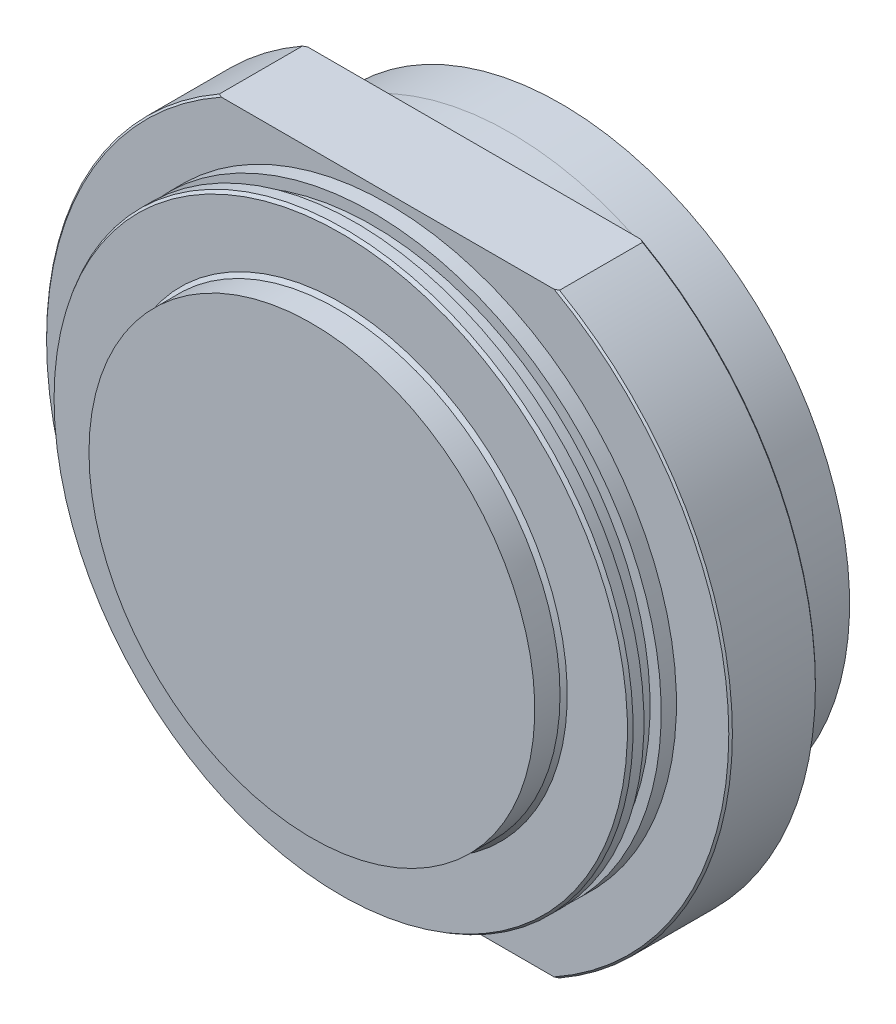
ISO-10303-21;
HEADER;
FILE_DESCRIPTION(('STEP AP214'),'2;1');
FILE_NAME('part.step','',(''),(''),'','','');
FILE_SCHEMA(('AUTOMOTIVE_DESIGN { 1 0 10303 214 1 1 1 1 }'));
ENDSEC;
DATA;
#1=APPLICATION_CONTEXT('core data for automotive mechanical design processes');
#2=APPLICATION_PROTOCOL_DEFINITION('international standard','automotive_design',2000,#1);
#3=PRODUCT_CONTEXT('',#1,'mechanical');
#4=PRODUCT('Part','Part','',(#3));
#5=PRODUCT_RELATED_PRODUCT_CATEGORY('part','',(#4));
#6=PRODUCT_DEFINITION_FORMATION('','',#4);
#7=PRODUCT_DEFINITION_CONTEXT('part definition',#1,'design');
#8=PRODUCT_DEFINITION('design','',#6,#7);
#9=PRODUCT_DEFINITION_SHAPE('','',#8);
#10=(LENGTH_UNIT() NAMED_UNIT(*) SI_UNIT(.MILLI.,.METRE.));
#11=(NAMED_UNIT(*) PLANE_ANGLE_UNIT() SI_UNIT($,.RADIAN.));
#12=(NAMED_UNIT(*) SI_UNIT($,.STERADIAN.) SOLID_ANGLE_UNIT());
#13=UNCERTAINTY_MEASURE_WITH_UNIT(LENGTH_MEASURE(1.E-05),#10,'distance_accuracy_value','');
#14=(GEOMETRIC_REPRESENTATION_CONTEXT(3) GLOBAL_UNCERTAINTY_ASSIGNED_CONTEXT((#13)) GLOBAL_UNIT_ASSIGNED_CONTEXT((#10,
#11,#12)) REPRESENTATION_CONTEXT('',''));
#15=CARTESIAN_POINT('',(0.,0.,0.));
#16=DIRECTION('',(0.,0.,1.));
#17=DIRECTION('',(1.,0.,0.));
#18=AXIS2_PLACEMENT_3D('',#15,#16,#17);
#19=CARTESIAN_POINT('',(1566.75,7.25022612595191E-12,1546.));
#20=DIRECTION('',(0.,0.,-1.));
#21=DIRECTION('',(-1.,0.,0.));
#22=AXIS2_PLACEMENT_3D('',#19,#20,#21);
#23=PLANE('',#22);
#24=CARTESIAN_POINT('',(1505.,7.24936917255478E-12,1546.));
#25=DIRECTION('',(0.,0.,-1.));
#26=DIRECTION('',(-1.,0.,0.));
#27=AXIS2_PLACEMENT_3D('',#24,#25,#26);
#28=CIRCLE('',#27,61.75);
#29=CARTESIAN_POINT('',(1443.25,7.24936917255478E-12,1546.));
#30=VERTEX_POINT('',#29);
#31=EDGE_CURVE('E473',#30,#30,#28,.T.);
#32=ORIENTED_EDGE('',*,*,#31,.F.);
#33=EDGE_LOOP('',(#32));
#34=FACE_BOUND('',#33,.T.);
#35=ADVANCED_FACE('F18',(#34),#23,.F.);
#36=CARTESIAN_POINT('',(1505.,7.24967405020568E-12,1470.));
#37=DIRECTION('',(0.,0.,-1.));
#38=DIRECTION('',(-1.,0.,0.));
#39=AXIS2_PLACEMENT_3D('',#36,#37,#38);
#40=CYLINDRICAL_SURFACE('',#39,61.75);
#41=CARTESIAN_POINT('',(1505.,7.25114412958305E-12,1539.0000000009));
#42=DIRECTION('',(0.,0.,-1.));
#43=DIRECTION('',(1.,0.,0.));
#44=AXIS2_PLACEMENT_3D('',#41,#42,#43);
#45=CIRCLE('',#44,61.7500000008973);
#46=CARTESIAN_POINT('',(1566.7500000009,7.25114412958305E-12,1539.0000000009));
#47=VERTEX_POINT('',#46);
#48=EDGE_CURVE('E475',#47,#47,#45,.T.);
#49=ORIENTED_EDGE('',*,*,#48,.F.);
#50=EDGE_LOOP('',(#49));
#51=FACE_BOUND('',#50,.T.);
#52=ORIENTED_EDGE('',*,*,#31,.T.);
#53=EDGE_LOOP('',(#52));
#54=FACE_BOUND('',#53,.T.);
#55=ADVANCED_FACE('F448',(#51,#54),#40,.T.);
#56=CARTESIAN_POINT('',(1505.,7.25114412958305E-12,1538.));
#57=DIRECTION('',(0.,0.,-1.));
#58=DIRECTION('',(-1.,0.,0.));
#59=AXIS2_PLACEMENT_3D('',#56,#57,#58);
#60=CONICAL_SURFACE('',#59,62.7499999999999,0.785398162500055);
#61=CARTESIAN_POINT('',(1505.,7.25114412958305E-12,1538.));
#62=DIRECTION('',(0.,0.,-1.));
#63=DIRECTION('',(-1.,0.,0.));
#64=AXIS2_PLACEMENT_3D('',#61,#62,#63);
#65=CIRCLE('',#64,62.7499999999999);
#66=CARTESIAN_POINT('',(1442.25,7.25114412958305E-12,1538.));
#67=VERTEX_POINT('',#66);
#68=EDGE_CURVE('E479',#67,#67,#65,.F.);
#69=ORIENTED_EDGE('',*,*,#68,.T.);
#70=EDGE_LOOP('',(#69));
#71=FACE_BOUND('',#70,.T.);
#72=ORIENTED_EDGE('',*,*,#48,.T.);
#73=EDGE_LOOP('',(#72));
#74=FACE_BOUND('',#73,.T.);
#75=ADVANCED_FACE('F438',(#71,#74),#60,.T.);
#76=CARTESIAN_POINT('',(1585.,7.25051148796371E-12,1538.));
#77=DIRECTION('',(0.,0.,-1.));
#78=DIRECTION('',(-1.,0.,0.));
#79=AXIS2_PLACEMENT_3D('',#76,#77,#78);
#80=PLANE('',#79);
#81=ORIENTED_EDGE('',*,*,#68,.F.);
#82=EDGE_LOOP('',(#81));
#83=FACE_BOUND('',#82,.T.);
#84=CARTESIAN_POINT('',(1505.,7.24975635080179E-12,1538.00000000035));
#85=DIRECTION('',(0.,0.,-1.));
#86=DIRECTION('',(-1.,0.,0.));
#87=AXIS2_PLACEMENT_3D('',#84,#85,#86);
#88=CIRCLE('',#87,79.4226497314088);
#89=CARTESIAN_POINT('',(1425.57735026859,7.24975635080179E-12,1538.00000000035));
#90=VERTEX_POINT('',#89);
#91=EDGE_CURVE('E597',#90,#90,#88,.T.);
#92=ORIENTED_EDGE('',*,*,#91,.F.);
#93=EDGE_LOOP('',(#92));
#94=FACE_BOUND('',#93,.T.);
#95=ADVANCED_FACE('F428',(#83,#94),#80,.F.);
#96=CARTESIAN_POINT('',(1505.,7.25114412958305E-12,1537.));
#97=DIRECTION('',(0.,0.,-1.));
#98=DIRECTION('',(-1.,0.,0.));
#99=AXIS2_PLACEMENT_3D('',#96,#97,#98);
#100=CONICAL_SURFACE('',#99,80.0000000000001,0.52359877499999);
#101=CARTESIAN_POINT('',(1505.,7.24940527648712E-12,1537.));
#102=DIRECTION('',(0.,0.,-1.));
#103=DIRECTION('',(-1.,0.,0.));
#104=AXIS2_PLACEMENT_3D('',#101,#102,#103);
#105=CIRCLE('',#104,80.);
#106=CARTESIAN_POINT('',(1425.,7.24940527648712E-12,1537.));
#107=VERTEX_POINT('',#106);
#108=EDGE_CURVE('E596',#107,#107,#105,.T.);
#109=ORIENTED_EDGE('',*,*,#108,.F.);
#110=EDGE_LOOP('',(#109));
#111=FACE_BOUND('',#110,.T.);
#112=ORIENTED_EDGE('',*,*,#91,.T.);
#113=EDGE_LOOP('',(#112));
#114=FACE_BOUND('',#113,.T.);
#115=ADVANCED_FACE('F418',(#111,#114),#100,.T.);
#116=CARTESIAN_POINT('',(1505.,7.24967405020568E-12,1470.));
#117=DIRECTION('',(0.,0.,-1.));
#118=DIRECTION('',(-1.,0.,0.));
#119=AXIS2_PLACEMENT_3D('',#116,#117,#118);
#120=CYLINDRICAL_SURFACE('',#119,80.);
#121=CARTESIAN_POINT('',(1505.,7.24941731113123E-12,1534.));
#122=DIRECTION('',(0.,0.,-1.));
#123=DIRECTION('',(-1.,0.,0.));
#124=AXIS2_PLACEMENT_3D('',#121,#122,#123);
#125=CIRCLE('',#124,80.);
#126=CARTESIAN_POINT('',(1425.,7.24941731113123E-12,1534.));
#127=VERTEX_POINT('',#126);
#128=EDGE_CURVE('E594',#127,#127,#125,.F.);
#129=ORIENTED_EDGE('',*,*,#128,.T.);
#130=EDGE_LOOP('',(#129));
#131=FACE_BOUND('',#130,.T.);
#132=ORIENTED_EDGE('',*,*,#108,.T.);
#133=EDGE_LOOP('',(#132));
#134=FACE_BOUND('',#133,.T.);
#135=ADVANCED_FACE('F408',(#131,#134),#120,.T.);
#136=CARTESIAN_POINT('',(1581.915,7.25048472118048E-12,1534.));
#137=DIRECTION('',(0.,0.,1.));
#138=DIRECTION('',(0.,-1.,0.));
#139=AXIS2_PLACEMENT_3D('',#136,#137,#138);
#140=PLANE('',#139);
#141=CARTESIAN_POINT('',(1505.,7.24941731113123E-12,1534.));
#142=DIRECTION('',(0.,0.,-1.));
#143=DIRECTION('',(-1.,0.,0.));
#144=AXIS2_PLACEMENT_3D('',#141,#142,#143);
#145=CIRCLE('',#144,76.915);
#146=CARTESIAN_POINT('',(1428.085,7.24941731113123E-12,1534.));
#147=VERTEX_POINT('',#146);
#148=EDGE_CURVE('E591',#147,#147,#145,.T.);
#149=ORIENTED_EDGE('',*,*,#148,.F.);
#150=EDGE_LOOP('',(#149));
#151=FACE_BOUND('',#150,.T.);
#152=ORIENTED_EDGE('',*,*,#128,.F.);
#153=EDGE_LOOP('',(#152));
#154=FACE_BOUND('',#153,.T.);
#155=ADVANCED_FACE('F398',(#151,#154),#140,.F.);
#156=CARTESIAN_POINT('',(1505.,7.24967405020568E-12,1470.));
#157=DIRECTION('',(0.,0.,-1.));
#158=DIRECTION('',(-1.,0.,0.));
#159=AXIS2_PLACEMENT_3D('',#156,#157,#158);
#160=CYLINDRICAL_SURFACE('',#159,76.915);
#161=CARTESIAN_POINT('',(1505.,7.24943648633086E-12,1529.22));
#162=DIRECTION('',(0.,0.,-1.));
#163=DIRECTION('',(-1.,0.,0.));
#164=AXIS2_PLACEMENT_3D('',#161,#162,#163);
#165=CIRCLE('',#164,76.915);
#166=CARTESIAN_POINT('',(1428.085,7.24943648633086E-12,1529.22));
#167=VERTEX_POINT('',#166);
#168=EDGE_CURVE('E588',#167,#167,#165,.F.);
#169=ORIENTED_EDGE('',*,*,#168,.T.);
#170=EDGE_LOOP('',(#169));
#171=FACE_BOUND('',#170,.T.);
#172=ORIENTED_EDGE('',*,*,#148,.T.);
#173=EDGE_LOOP('',(#172));
#174=FACE_BOUND('',#173,.T.);
#175=ADVANCED_FACE('F388',(#171,#174),#160,.T.);
#176=CARTESIAN_POINT('',(1585.,7.25054670935549E-12,1529.22));
#177=DIRECTION('',(0.,0.,-1.));
#178=DIRECTION('',(-1.,0.,0.));
#179=AXIS2_PLACEMENT_3D('',#176,#177,#178);
#180=PLANE('',#179);
#181=CARTESIAN_POINT('',(1505.,7.24943648633086E-12,1529.22));
#182=DIRECTION('',(0.,0.,-1.));
#183=DIRECTION('',(-1.,0.,0.));
#184=AXIS2_PLACEMENT_3D('',#181,#182,#183);
#185=CIRCLE('',#184,80.);
#186=CARTESIAN_POINT('',(1425.,7.24943648633086E-12,1529.22));
#187=VERTEX_POINT('',#186);
#188=EDGE_CURVE('E584',#187,#187,#185,.T.);
#189=ORIENTED_EDGE('',*,*,#188,.F.);
#190=EDGE_LOOP('',(#189));
#191=FACE_BOUND('',#190,.T.);
#192=ORIENTED_EDGE('',*,*,#168,.F.);
#193=EDGE_LOOP('',(#192));
#194=FACE_BOUND('',#193,.T.);
#195=ADVANCED_FACE('F378',(#191,#194),#180,.F.);
#196=CARTESIAN_POINT('',(1505.,7.24967405020568E-12,1470.));
#197=DIRECTION('',(0.,0.,-1.));
#198=DIRECTION('',(-1.,0.,0.));
#199=AXIS2_PLACEMENT_3D('',#196,#197,#198);
#200=CYLINDRICAL_SURFACE('',#199,80.);
#201=CARTESIAN_POINT('',(1505.,7.24945341506358E-12,1525.));
#202=DIRECTION('',(0.,0.,-1.));
#203=DIRECTION('',(-1.,0.,0.));
#204=AXIS2_PLACEMENT_3D('',#201,#202,#203);
#205=CIRCLE('',#204,80.);
#206=CARTESIAN_POINT('',(1425.,7.24945341506358E-12,1525.));
#207=VERTEX_POINT('',#206);
#208=EDGE_CURVE('E567',#207,#207,#205,.F.);
#209=ORIENTED_EDGE('',*,*,#208,.T.);
#210=EDGE_LOOP('',(#209));
#211=FACE_BOUND('',#210,.T.);
#212=ORIENTED_EDGE('',*,*,#188,.T.);
#213=EDGE_LOOP('',(#212));
#214=FACE_BOUND('',#213,.T.);
#215=ADVANCED_FACE('F368',(#211,#214),#200,.T.);
#216=CARTESIAN_POINT('',(1505.,7.25114412958305E-12,1524.5));
#217=DIRECTION('',(0.,0.,-1.));
#218=DIRECTION('',(-1.,0.,0.));
#219=AXIS2_PLACEMENT_3D('',#216,#217,#218);
#220=CONICAL_SURFACE('',#219,94.9999999999993,0.785398162499944);
#221=CARTESIAN_POINT('',(1551.08687448743,82.5000000003991,1525.00000000045));
#222=CARTESIAN_POINT('',(1551.12918921244,82.5000000003743,1524.97936345623));
#223=CARTESIAN_POINT('',(1551.17149540316,82.5000000002466,1524.95870941293));
#224=CARTESIAN_POINT('',(1551.25612415679,82.4999999999069,1524.91735012217));
#225=CARTESIAN_POINT('',(1551.29844670623,82.4999999996949,1524.89664484716));
#226=CARTESIAN_POINT('',(1551.38310824844,82.4999999993086,1524.85518309306));
#227=CARTESIAN_POINT('',(1551.42544722771,82.4999999991342,1524.83442658642));
#228=CARTESIAN_POINT('',(1551.51014170056,82.4999999988857,1524.79286236904));
#229=CARTESIAN_POINT('',(1551.55249718061,82.4999999988116,1524.77205463075));
#230=CARTESIAN_POINT('',(1551.6372247257,82.4999999987843,1524.73038795008));
#231=CARTESIAN_POINT('',(1551.67959677719,82.4999999988312,1524.70952898015));
#232=CARTESIAN_POINT('',(1551.76435753565,82.4999999990214,1524.66775983618));
#233=CARTESIAN_POINT('',(1551.80674622904,82.4999999991647,1524.6468496346));
#234=CARTESIAN_POINT('',(1551.8915403415,82.4999999994834,1524.60497802735));
#235=CARTESIAN_POINT('',(1551.93394574698,82.4999999996587,1524.58401659415));
#236=CARTESIAN_POINT('',(1552.01877335365,82.4999999999254,1524.54204252356));
#237=CARTESIAN_POINT('',(1552.06119554122,82.5000000000167,1524.52102985864));
#238=CARTESIAN_POINT('',(1552.10360920354,82.5000000000076,1524.5));
#239=B_SPLINE_CURVE_WITH_KNOTS('',3,(#221,#222,#223,#224,#225,#226,#227,#228,#229,#230,#231,
#232,#233,#234,#235,#236,#237,#238),.UNSPECIFIED.,.F.,.F.,(4,2,2,2,2,2,2,2,4),(0.,
0.14123606127447,0.2825836997736,0.42404320318382,0.565614858090041,0.707298949978761,
0.849095763238674,0.991005581164971,1.13302868595976),.UNSPECIFIED.);
#240=CARTESIAN_POINT('',(1552.10360920354,82.5000000000074,1524.5));
#241=VERTEX_POINT('',#240);
#242=CARTESIAN_POINT('',(1551.08687448778,82.5000000002032,1525.00000000045));
#243=VERTEX_POINT('',#242);
#244=EDGE_CURVE('E647',#241,#243,#239,.F.);
#245=ORIENTED_EDGE('',*,*,#244,.T.);
#246=CARTESIAN_POINT('',(1505.,7.25055980167483E-12,1525.00000000045));
#247=DIRECTION('',(0.,0.,-1.));
#248=DIRECTION('',(-1.,0.,0.));
#249=AXIS2_PLACEMENT_3D('',#246,#247,#248);
#250=CIRCLE('',#249,94.5000000004481);
#251=CARTESIAN_POINT('',(1551.08687448778,-82.5000000001886,1525.00000000045));
#252=VERTEX_POINT('',#251);
#253=EDGE_CURVE('E574',#243,#252,#250,.T.);
#254=ORIENTED_EDGE('',*,*,#253,.T.);
#255=CARTESIAN_POINT('',(1552.10360920354,-82.4999999999929,1524.5));
#256=CARTESIAN_POINT('',(1552.06119554122,-82.500000000002,1524.52102985864));
#257=CARTESIAN_POINT('',(1552.01877335365,-82.4999999999107,1524.54204252356));
#258=CARTESIAN_POINT('',(1551.93394574698,-82.499999999644,1524.58401659415));
#259=CARTESIAN_POINT('',(1551.8915403415,-82.4999999994686,1524.60497802735));
#260=CARTESIAN_POINT('',(1551.80674622904,-82.49999999915,1524.6468496346));
#261=CARTESIAN_POINT('',(1551.76435753565,-82.4999999990067,1524.66775983618));
#262=CARTESIAN_POINT('',(1551.67959677719,-82.4999999988166,1524.70952898015));
#263=CARTESIAN_POINT('',(1551.6372247257,-82.4999999987696,1524.73038795008));
#264=CARTESIAN_POINT('',(1551.55249718061,-82.4999999987969,1524.77205463075));
#265=CARTESIAN_POINT('',(1551.51014170056,-82.4999999988711,1524.79286236904));
#266=CARTESIAN_POINT('',(1551.42544722771,-82.4999999991196,1524.83442658642));
#267=CARTESIAN_POINT('',(1551.38310824844,-82.4999999992938,1524.85518309306));
#268=CARTESIAN_POINT('',(1551.29844670623,-82.4999999996802,1524.89664484716));
#269=CARTESIAN_POINT('',(1551.25612415679,-82.4999999998922,1524.91735012217));
#270=CARTESIAN_POINT('',(1551.17149540316,-82.5000000002319,1524.95870941293));
#271=CARTESIAN_POINT('',(1551.12918921244,-82.5000000003597,1524.97936345623));
#272=CARTESIAN_POINT('',(1551.08687448743,-82.5000000003844,1525.00000000045));
#273=B_SPLINE_CURVE_WITH_KNOTS('',3,(#255,#256,#257,#258,#259,#260,#261,#262,#263,#264,#265,
#266,#267,#268,#269,#270,#271,#272),.UNSPECIFIED.,.F.,.F.,(4,2,2,2,2,2,2,2,4),(0.,
0.142023104794789,0.283932922720887,0.425729735981199,0.56741382786972,0.70898548277594,
0.85044498618616,0.991792624685291,1.13302868595976),.UNSPECIFIED.);
#274=CARTESIAN_POINT('',(1552.10360920354,-82.4999999999928,1524.5));
#275=VERTEX_POINT('',#274);
#276=EDGE_CURVE('E587',#252,#275,#273,.F.);
#277=ORIENTED_EDGE('',*,*,#276,.T.);
#278=CARTESIAN_POINT('',(1505.,7.2494554208376E-12,1524.5));
#279=DIRECTION('',(0.,0.,-1.));
#280=DIRECTION('',(-1.,0.,0.));
#281=AXIS2_PLACEMENT_3D('',#278,#279,#280);
#282=CIRCLE('',#281,95.);
#283=EDGE_CURVE('E565',#241,#275,#282,.T.);
#284=ORIENTED_EDGE('',*,*,#283,.F.);
#285=EDGE_LOOP('',(#245,#254,#277,#284));
#286=FACE_BOUND('',#285,.T.);
#287=ADVANCED_FACE('F358',(#286),#220,.T.);
#288=CARTESIAN_POINT('',(1505.,7.25114412958305E-12,1524.5));
#289=DIRECTION('',(0.,0.,-1.));
#290=DIRECTION('',(-1.,0.,0.));
#291=AXIS2_PLACEMENT_3D('',#288,#289,#290);
#292=CONICAL_SURFACE('',#291,94.9999999999997,0.78539816250061);
#293=CARTESIAN_POINT('',(1458.91312551257,-82.500000000385,1525.00000000045));
#294=CARTESIAN_POINT('',(1458.87081078756,-82.5000000003604,1524.97936345623));
#295=CARTESIAN_POINT('',(1458.82850459684,-82.5000000002329,1524.95870941293));
#296=CARTESIAN_POINT('',(1458.74387584321,-82.4999999998937,1524.91735012217));
#297=CARTESIAN_POINT('',(1458.70155329377,-82.4999999996818,1524.89664484716));
#298=CARTESIAN_POINT('',(1458.61689175156,-82.4999999992957,1524.85518309306));
#299=CARTESIAN_POINT('',(1458.57455277228,-82.4999999991215,1524.83442658641));
#300=CARTESIAN_POINT('',(1458.48985829943,-82.4999999988731,1524.79286236903));
#301=CARTESIAN_POINT('',(1458.44750281939,-82.4999999987991,1524.77205463075));
#302=CARTESIAN_POINT('',(1458.3627752743,-82.4999999987718,1524.73038795007));
#303=CARTESIAN_POINT('',(1458.3204032228,-82.4999999988187,1524.70952898014));
#304=CARTESIAN_POINT('',(1458.23564246435,-82.4999999990087,1524.66775983617));
#305=CARTESIAN_POINT('',(1458.19325377096,-82.4999999991519,1524.6468496346));
#306=CARTESIAN_POINT('',(1458.1084596585,-82.4999999994702,1524.60497802735));
#307=CARTESIAN_POINT('',(1458.06605425301,-82.4999999996455,1524.58401659415));
#308=CARTESIAN_POINT('',(1457.98122664635,-82.4999999999118,1524.54204252355));
#309=CARTESIAN_POINT('',(1457.93880445878,-82.5000000000028,1524.52102985864));
#310=CARTESIAN_POINT('',(1457.89639079646,-82.4999999999934,1524.5));
#311=B_SPLINE_CURVE_WITH_KNOTS('',3,(#293,#294,#295,#296,#297,#298,#299,#300,#301,#302,#303,
#304,#305,#306,#307,#308,#309,#310),.UNSPECIFIED.,.F.,.F.,(4,2,2,2,2,2,2,2,4),(0.,
0.14123606127794,0.282583699779154,0.424043203190762,0.565614858097679,0.707298949985605,
0.849095763244329,0.991005581168443,1.13302868595996),.UNSPECIFIED.);
#312=CARTESIAN_POINT('',(1457.89639079646,-82.4999999999931,1524.5));
#313=VERTEX_POINT('',#312);
#314=CARTESIAN_POINT('',(1458.91312551222,-82.5000000001889,1525.00000000045));
#315=VERTEX_POINT('',#314);
#316=EDGE_CURVE('E568',#313,#315,#311,.F.);
#317=ORIENTED_EDGE('',*,*,#316,.T.);
#318=CARTESIAN_POINT('',(1505.,7.25055980167483E-12,1525.00000000045));
#319=DIRECTION('',(0.,0.,-1.));
#320=DIRECTION('',(-1.,0.,0.));
#321=AXIS2_PLACEMENT_3D('',#318,#319,#320);
#322=CIRCLE('',#321,94.5000000004484);
#323=CARTESIAN_POINT('',(1458.91312551222,82.5000000002034,1525.00000000045));
#324=VERTEX_POINT('',#323);
#325=EDGE_CURVE('E570',#315,#324,#322,.T.);
#326=ORIENTED_EDGE('',*,*,#325,.T.);
#327=CARTESIAN_POINT('',(1457.89639079646,82.5000000000079,1524.5));
#328=CARTESIAN_POINT('',(1457.93880445878,82.5000000000173,1524.52102985864));
#329=CARTESIAN_POINT('',(1457.98122664635,82.4999999999262,1524.54204252355));
#330=CARTESIAN_POINT('',(1458.06605425301,82.4999999996599,1524.58401659415));
#331=CARTESIAN_POINT('',(1458.1084596585,82.4999999994847,1524.60497802735));
#332=CARTESIAN_POINT('',(1458.19325377096,82.4999999991663,1524.6468496346));
#333=CARTESIAN_POINT('',(1458.23564246435,82.4999999990232,1524.66775983617));
#334=CARTESIAN_POINT('',(1458.3204032228,82.4999999988331,1524.70952898014));
#335=CARTESIAN_POINT('',(1458.3627752743,82.4999999987862,1524.73038795007));
#336=CARTESIAN_POINT('',(1458.44750281939,82.4999999988135,1524.77205463075));
#337=CARTESIAN_POINT('',(1458.48985829944,82.4999999988876,1524.79286236903));
#338=CARTESIAN_POINT('',(1458.57455277228,82.499999999136,1524.83442658642));
#339=CARTESIAN_POINT('',(1458.61689175156,82.4999999993102,1524.85518309306));
#340=CARTESIAN_POINT('',(1458.70155329377,82.4999999996963,1524.89664484716));
#341=CARTESIAN_POINT('',(1458.74387584321,82.4999999999081,1524.91735012217));
#342=CARTESIAN_POINT('',(1458.82850459684,82.5000000002474,1524.95870941293));
#343=CARTESIAN_POINT('',(1458.87081078756,82.5000000003749,1524.97936345623));
#344=CARTESIAN_POINT('',(1458.91312551257,82.5000000003994,1525.00000000045));
#345=B_SPLINE_CURVE_WITH_KNOTS('',3,(#327,#328,#329,#330,#331,#332,#333,#334,#335,#336,#337,
#338,#339,#340,#341,#342,#343,#344),.UNSPECIFIED.,.F.,.F.,(4,2,2,2,2,2,2,2,4),(0.,
0.142023104791812,0.283932922715828,0.425729735974849,0.567413827863073,0.708985482769692,
0.850444986181003,0.991792624682514,1.13302868595996),.UNSPECIFIED.);
#346=CARTESIAN_POINT('',(1457.89639079646,82.5000000000076,1524.5));
#347=VERTEX_POINT('',#346);
#348=EDGE_CURVE('E646',#324,#347,#345,.F.);
#349=ORIENTED_EDGE('',*,*,#348,.T.);
#350=CARTESIAN_POINT('',(1505.,7.2494554208376E-12,1524.5));
#351=DIRECTION('',(0.,0.,-1.));
#352=DIRECTION('',(-1.,0.,0.));
#353=AXIS2_PLACEMENT_3D('',#350,#351,#352);
#354=CIRCLE('',#353,95.);
#355=EDGE_CURVE('E533',#313,#347,#354,.T.);
#356=ORIENTED_EDGE('',*,*,#355,.F.);
#357=EDGE_LOOP('',(#317,#326,#349,#356));
#358=FACE_BOUND('',#357,.T.);
#359=ADVANCED_FACE('F348',(#358),#292,.T.);
#360=CARTESIAN_POINT('',(1505.,7.24967405020568E-12,1470.));
#361=DIRECTION('',(0.,0.,-1.));
#362=DIRECTION('',(-1.,0.,0.));
#363=AXIS2_PLACEMENT_3D('',#360,#361,#362);
#364=CYLINDRICAL_SURFACE('',#363,95.);
#365=DIRECTION('',(0.,0.,1.));
#366=VECTOR('',#365,1.);
#367=CARTESIAN_POINT('',(1552.10360920354,-82.4999999999928,1546.));
#368=LINE('',#367,#366);
#369=CARTESIAN_POINT('',(1552.10360920354,-82.4999999999931,1501.5));
#370=VERTEX_POINT('',#369);
#371=EDGE_CURVE('E524',#275,#370,#368,.F.);
#372=ORIENTED_EDGE('',*,*,#371,.T.);
#373=CARTESIAN_POINT('',(1505.,7.25114412958305E-12,1501.5));
#374=DIRECTION('',(0.,0.,1.));
#375=DIRECTION('',(-1.,0.,0.));
#376=AXIS2_PLACEMENT_3D('',#373,#374,#375);
#377=CIRCLE('',#376,94.9999999999995);
#378=CARTESIAN_POINT('',(1552.10360920354,82.5000000000076,1501.5));
#379=VERTEX_POINT('',#378);
#380=EDGE_CURVE('E557',#379,#370,#377,.F.);
#381=ORIENTED_EDGE('',*,*,#380,.F.);
#382=DIRECTION('',(0.,0.,1.));
#383=VECTOR('',#382,1.);
#384=CARTESIAN_POINT('',(1552.10360920354,82.5000000000073,1546.));
#385=LINE('',#384,#383);
#386=EDGE_CURVE('E520',#379,#241,#385,.T.);
#387=ORIENTED_EDGE('',*,*,#386,.T.);
#388=ORIENTED_EDGE('',*,*,#283,.T.);
#389=EDGE_LOOP('',(#372,#381,#387,#388));
#390=FACE_BOUND('',#389,.T.);
#391=ADVANCED_FACE('F338',(#390),#364,.T.);
#392=CARTESIAN_POINT('',(1600.,7.25077180490532E-12,1525.));
#393=DIRECTION('',(0.,0.,-1.));
#394=DIRECTION('',(-1.,0.,0.));
#395=AXIS2_PLACEMENT_3D('',#392,#393,#394);
#396=PLANE('',#395);
#397=DIRECTION('',(1.,0.,0.));
#398=VECTOR('',#397,1.);
#399=CARTESIAN_POINT('',(1552.10360920354,-82.4999999999928,1525.));
#400=LINE('',#399,#398);
#401=EDGE_CURVE('E527',#315,#252,#400,.T.);
#402=ORIENTED_EDGE('',*,*,#401,.T.);
#403=ORIENTED_EDGE('',*,*,#253,.F.);
#404=DIRECTION('',(1.,0.,0.));
#405=VECTOR('',#404,1.);
#406=CARTESIAN_POINT('',(1552.10360920354,82.5000000000073,1525.));
#407=LINE('',#406,#405);
#408=EDGE_CURVE('E517',#243,#324,#407,.F.);
#409=ORIENTED_EDGE('',*,*,#408,.T.);
#410=ORIENTED_EDGE('',*,*,#325,.F.);
#411=EDGE_LOOP('',(#402,#403,#409,#410));
#412=FACE_BOUND('',#411,.T.);
#413=ORIENTED_EDGE('',*,*,#208,.F.);
#414=EDGE_LOOP('',(#413));
#415=FACE_BOUND('',#414,.T.);
#416=ADVANCED_FACE('F328',(#412,#415),#396,.F.);
#417=CARTESIAN_POINT('',(1505.,7.24967405020568E-12,1470.));
#418=DIRECTION('',(0.,0.,-1.));
#419=DIRECTION('',(-1.,0.,0.));
#420=AXIS2_PLACEMENT_3D('',#417,#418,#419);
#421=CYLINDRICAL_SURFACE('',#420,95.);
#422=DIRECTION('',(0.,0.,1.));
#423=VECTOR('',#422,1.);
#424=CARTESIAN_POINT('',(1457.89639079646,82.5000000000073,1546.));
#425=LINE('',#424,#423);
#426=CARTESIAN_POINT('',(1457.89639079646,82.5000000000075,1501.5));
#427=VERTEX_POINT('',#426);
#428=EDGE_CURVE('E514',#347,#427,#425,.F.);
#429=ORIENTED_EDGE('',*,*,#428,.T.);
#430=CARTESIAN_POINT('',(1505.,7.25114412958305E-12,1501.5));
#431=DIRECTION('',(0.,0.,1.));
#432=DIRECTION('',(-1.,0.,0.));
#433=AXIS2_PLACEMENT_3D('',#430,#431,#432);
#434=CIRCLE('',#433,94.9999999999995);
#435=CARTESIAN_POINT('',(1457.89639079646,-82.4999999999929,1501.5));
#436=VERTEX_POINT('',#435);
#437=EDGE_CURVE('E513',#436,#427,#434,.F.);
#438=ORIENTED_EDGE('',*,*,#437,.F.);
#439=DIRECTION('',(0.,0.,1.));
#440=VECTOR('',#439,1.);
#441=CARTESIAN_POINT('',(1457.89639079646,-82.4999999999928,1546.));
#442=LINE('',#441,#440);
#443=EDGE_CURVE('E530',#436,#313,#442,.T.);
#444=ORIENTED_EDGE('',*,*,#443,.T.);
#445=ORIENTED_EDGE('',*,*,#355,.T.);
#446=EDGE_LOOP('',(#429,#438,#444,#445));
#447=FACE_BOUND('',#446,.T.);
#448=ADVANCED_FACE('F318',(#447),#421,.T.);
#449=CARTESIAN_POINT('',(1552.10360920354,-82.4999999999928,1546.));
#450=DIRECTION('',(0.,1.,0.));
#451=DIRECTION('',(0.,0.,1.));
#452=AXIS2_PLACEMENT_3D('',#449,#450,#451);
#453=PLANE('',#452);
#454=DIRECTION('',(1.,0.,0.));
#455=VECTOR('',#454,1.);
#456=CARTESIAN_POINT('',(1585.,-82.4999999999928,1501.));
#457=LINE('',#456,#455);
#458=CARTESIAN_POINT('',(1458.91312551176,-82.5000000001887,1500.99999999978));
#459=VERTEX_POINT('',#458);
#460=CARTESIAN_POINT('',(1551.08687448778,-82.500000000189,1500.99999999955));
#461=VERTEX_POINT('',#460);
#462=EDGE_CURVE('E510',#459,#461,#457,.T.);
#463=ORIENTED_EDGE('',*,*,#462,.T.);
#464=CARTESIAN_POINT('',(1551.08687448743,-82.5000000003852,1500.99999999955));
#465=CARTESIAN_POINT('',(1551.1291892124,-82.5000000003598,1501.02063654374));
#466=CARTESIAN_POINT('',(1551.17149540308,-82.5000000002317,1501.04129058703));
#467=CARTESIAN_POINT('',(1551.25612415663,-82.4999999998914,1501.08264987775));
#468=CARTESIAN_POINT('',(1551.29844670604,-82.4999999996792,1501.10335515275));
#469=CARTESIAN_POINT('',(1551.3831082482,-82.4999999992927,1501.14481690683));
#470=CARTESIAN_POINT('',(1551.42544722746,-82.4999999991183,1501.16557341346));
#471=CARTESIAN_POINT('',(1551.51014170028,-82.4999999988699,1501.20713763082));
#472=CARTESIAN_POINT('',(1551.55249718033,-82.4999999987958,1501.22794536911));
#473=CARTESIAN_POINT('',(1551.63722472541,-82.4999999987688,1501.26961204979));
#474=CARTESIAN_POINT('',(1551.67959677692,-82.4999999988159,1501.29047101972));
#475=CARTESIAN_POINT('',(1551.76435753539,-82.4999999990064,1501.3322401637));
#476=CARTESIAN_POINT('',(1551.8067462288,-82.4999999991499,1501.35315036529));
#477=CARTESIAN_POINT('',(1551.89154034132,-82.4999999994688,1501.39502197256));
#478=CARTESIAN_POINT('',(1551.93394574683,-82.4999999996443,1501.41598340577));
#479=CARTESIAN_POINT('',(1552.01877335357,-82.4999999999113,1501.4579574764));
#480=CARTESIAN_POINT('',(1552.06119554118,-82.5000000000026,1501.47897014134));
#481=CARTESIAN_POINT('',(1552.10360920354,-82.4999999999935,1501.5));
#482=B_SPLINE_CURVE_WITH_KNOTS('',3,(#464,#465,#466,#467,#468,#469,#470,#471,#472,#473,#474,
#475,#476,#477,#478,#479,#480,#481),.UNSPECIFIED.,.F.,.F.,(4,2,2,2,2,2,2,2,4),(0.,
0.141236061134558,0.282583699533296,0.424043202883339,0.565614857769403,0.707298949677784,
0.849095762997973,0.991005581024565,1.13302868595947),.UNSPECIFIED.);
#483=EDGE_CURVE('E526',#370,#461,#482,.F.);
#484=ORIENTED_EDGE('',*,*,#483,.F.);
#485=ORIENTED_EDGE('',*,*,#371,.F.);
#486=ORIENTED_EDGE('',*,*,#276,.F.);
#487=ORIENTED_EDGE('',*,*,#401,.F.);
#488=ORIENTED_EDGE('',*,*,#316,.F.);
#489=ORIENTED_EDGE('',*,*,#443,.F.);
#490=CARTESIAN_POINT('',(1457.89639079646,-82.499999999993,1501.5));
#491=CARTESIAN_POINT('',(1457.93880445882,-82.5000000000024,1501.47897014133));
#492=CARTESIAN_POINT('',(1457.98122664644,-82.4999999999113,1501.4579574764));
#493=CARTESIAN_POINT('',(1458.06605425318,-82.4999999996448,1501.41598340577));
#494=CARTESIAN_POINT('',(1458.10845965869,-82.4999999994695,1501.39502197256));
#495=CARTESIAN_POINT('',(1458.1932537712,-82.4999999991508,1501.35315036528));
#496=CARTESIAN_POINT('',(1458.23564246461,-82.4999999990074,1501.3322401637));
#497=CARTESIAN_POINT('',(1458.32040322309,-82.499999998817,1501.29047101972));
#498=CARTESIAN_POINT('',(1458.36277527459,-82.4999999987699,1501.26961204978));
#499=CARTESIAN_POINT('',(1458.44750281968,-82.499999998797,1501.22794536911));
#500=CARTESIAN_POINT('',(1458.48985829972,-82.499999998871,1501.20713763082));
#501=CARTESIAN_POINT('',(1458.57455277254,-82.4999999991193,1501.16557341345));
#502=CARTESIAN_POINT('',(1458.6168917518,-82.4999999992935,1501.14481690682));
#503=CARTESIAN_POINT('',(1458.70155329396,-82.4999999996798,1501.10335515275));
#504=CARTESIAN_POINT('',(1458.74387584337,-82.4999999998918,1501.08264987775));
#505=CARTESIAN_POINT('',(1458.82850459692,-82.5000000002317,1501.04129058703));
#506=CARTESIAN_POINT('',(1458.87081078761,-82.5000000003596,1501.02063654374));
#507=CARTESIAN_POINT('',(1458.91312551257,-82.5000000003847,1500.99999999955));
#508=B_SPLINE_CURVE_WITH_KNOTS('',3,(#490,#491,#492,#493,#494,#495,#496,#497,#498,#499,#500,
#501,#502,#503,#504,#505,#506,#507),.UNSPECIFIED.,.F.,.F.,(4,2,2,2,2,2,2,2,4),(0.,
0.142023104938083,0.283932922966563,0.425729736288046,0.567413828196825,0.708985483082689,
0.850444986431438,0.991792624828288,1.13302868595996),.UNSPECIFIED.);
#509=EDGE_CURVE('E535',#459,#436,#508,.F.);
#510=ORIENTED_EDGE('',*,*,#509,.F.);
#511=EDGE_LOOP('',(#463,#484,#485,#486,#487,#488,#489,#510));
#512=FACE_BOUND('',#511,.T.);
#513=ADVANCED_FACE('F308',(#512),#453,.F.);
#514=CARTESIAN_POINT('',(1505.,7.25114412958305E-12,1501.5));
#515=DIRECTION('',(0.,0.,1.));
#516=DIRECTION('',(1.,0.,0.));
#517=AXIS2_PLACEMENT_3D('',#514,#515,#516);
#518=CONICAL_SURFACE('',#517,94.9999999999995,0.785398162499944);
#519=CARTESIAN_POINT('',(1552.10360920354,82.5000000000078,1501.5));
#520=CARTESIAN_POINT('',(1552.06119554118,82.5000000000169,1501.47897014133));
#521=CARTESIAN_POINT('',(1552.01877335356,82.4999999999256,1501.4579574764));
#522=CARTESIAN_POINT('',(1551.93394574683,82.4999999996587,1501.41598340577));
#523=CARTESIAN_POINT('',(1551.89154034131,82.4999999994831,1501.39502197256));
#524=CARTESIAN_POINT('',(1551.8067462288,82.4999999991642,1501.35315036528));
#525=CARTESIAN_POINT('',(1551.76435753539,82.4999999990207,1501.3322401637));
#526=CARTESIAN_POINT('',(1551.67959677691,82.4999999988302,1501.29047101972));
#527=CARTESIAN_POINT('',(1551.63722472541,82.4999999987831,1501.26961204978));
#528=CARTESIAN_POINT('',(1551.55249718032,82.4999999988101,1501.22794536911));
#529=CARTESIAN_POINT('',(1551.51014170028,82.4999999988841,1501.20713763082));
#530=CARTESIAN_POINT('',(1551.42544722746,82.4999999991326,1501.16557341346));
#531=CARTESIAN_POINT('',(1551.3831082482,82.4999999993069,1501.14481690682));
#532=CARTESIAN_POINT('',(1551.29844670604,82.4999999996935,1501.10335515275));
#533=CARTESIAN_POINT('',(1551.25612415663,82.4999999999057,1501.08264987775));
#534=CARTESIAN_POINT('',(1551.17149540308,82.5000000002459,1501.04129058703));
#535=CARTESIAN_POINT('',(1551.1291892124,82.5000000003741,1501.02063654374));
#536=CARTESIAN_POINT('',(1551.08687448743,82.5000000003995,1500.99999999955));
#537=B_SPLINE_CURVE_WITH_KNOTS('',3,(#519,#520,#521,#522,#523,#524,#525,#526,#527,#528,#529,
#530,#531,#532,#533,#534,#535,#536),.UNSPECIFIED.,.F.,.F.,(4,2,2,2,2,2,2,2,4),(0.,
0.142023104936096,0.283932922962985,0.425729736283472,0.567413828192052,0.708985483078116,
0.850444986427662,0.991792624825806,1.13302868595947),.UNSPECIFIED.);
#538=CARTESIAN_POINT('',(1551.08687448778,82.5000000002034,1500.99999999955));
#539=VERTEX_POINT('',#538);
#540=EDGE_CURVE('E523',#539,#379,#537,.F.);
#541=ORIENTED_EDGE('',*,*,#540,.T.);
#542=ORIENTED_EDGE('',*,*,#380,.T.);
#543=ORIENTED_EDGE('',*,*,#483,.T.);
#544=CARTESIAN_POINT('',(1505.,7.25114412958305E-12,1500.99999999955));
#545=DIRECTION('',(0.,0.,1.));
#546=DIRECTION('',(1.,0.,0.));
#547=AXIS2_PLACEMENT_3D('',#544,#545,#546);
#548=CIRCLE('',#547,94.5000000004487);
#549=EDGE_CURVE('E509',#461,#539,#548,.T.);
#550=ORIENTED_EDGE('',*,*,#549,.T.);
#551=EDGE_LOOP('',(#541,#542,#543,#550));
#552=FACE_BOUND('',#551,.T.);
#553=ADVANCED_FACE('F298',(#552),#518,.T.);
#554=CARTESIAN_POINT('',(1552.10360920354,82.5000000000073,1546.));
#555=DIRECTION('',(0.,-1.,0.));
#556=DIRECTION('',(1.,0.,0.));
#557=AXIS2_PLACEMENT_3D('',#554,#555,#556);
#558=PLANE('',#557);
#559=ORIENTED_EDGE('',*,*,#428,.F.);
#560=ORIENTED_EDGE('',*,*,#348,.F.);
#561=ORIENTED_EDGE('',*,*,#408,.F.);
#562=ORIENTED_EDGE('',*,*,#244,.F.);
#563=ORIENTED_EDGE('',*,*,#386,.F.);
#564=ORIENTED_EDGE('',*,*,#540,.F.);
#565=DIRECTION('',(1.,0.,0.));
#566=VECTOR('',#565,1.);
#567=CARTESIAN_POINT('',(1585.,82.5000000000073,1501.));
#568=LINE('',#567,#566);
#569=CARTESIAN_POINT('',(1458.91312551222,82.5000000002033,1500.99999999955));
#570=VERTEX_POINT('',#569);
#571=EDGE_CURVE('E505',#539,#570,#568,.F.);
#572=ORIENTED_EDGE('',*,*,#571,.T.);
#573=CARTESIAN_POINT('',(1458.91312551257,82.5000000003992,1500.99999999955));
#574=CARTESIAN_POINT('',(1458.87081078761,82.5000000003741,1501.02063654374));
#575=CARTESIAN_POINT('',(1458.82850459693,82.5000000002462,1501.04129058703));
#576=CARTESIAN_POINT('',(1458.74387584337,82.4999999999063,1501.08264987775));
#577=CARTESIAN_POINT('',(1458.70155329396,82.4999999996943,1501.10335515275));
#578=CARTESIAN_POINT('',(1458.6168917518,82.4999999993079,1501.14481690682));
#579=CARTESIAN_POINT('',(1458.57455277254,82.4999999991337,1501.16557341345));
#580=CARTESIAN_POINT('',(1458.48985829972,82.4999999988854,1501.20713763082));
#581=CARTESIAN_POINT('',(1458.44750281968,82.4999999988115,1501.22794536911));
#582=CARTESIAN_POINT('',(1458.36277527459,82.4999999987844,1501.26961204978));
#583=CARTESIAN_POINT('',(1458.32040322309,82.4999999988315,1501.29047101971));
#584=CARTESIAN_POINT('',(1458.23564246461,82.4999999990219,1501.3322401637));
#585=CARTESIAN_POINT('',(1458.1932537712,82.4999999991653,1501.35315036528));
#586=CARTESIAN_POINT('',(1458.10845965869,82.499999999484,1501.39502197256));
#587=CARTESIAN_POINT('',(1458.06605425318,82.4999999996593,1501.41598340577));
#588=CARTESIAN_POINT('',(1457.98122664644,82.4999999999258,1501.4579574764));
#589=CARTESIAN_POINT('',(1457.93880445882,82.5000000000169,1501.47897014133));
#590=CARTESIAN_POINT('',(1457.89639079646,82.5000000000075,1501.5));
#591=B_SPLINE_CURVE_WITH_KNOTS('',3,(#573,#574,#575,#576,#577,#578,#579,#580,#581,#582,#583,
#584,#585,#586,#587,#588,#589,#590),.UNSPECIFIED.,.F.,.F.,(4,2,2,2,2,2,2,2,4),(0.,
0.141236061131176,0.282583699527826,0.424043202876477,0.565614857762142,0.707298949670921,
0.849095762992502,0.99100558102138,1.13302868595996),.UNSPECIFIED.);
#592=EDGE_CURVE('E36',#427,#570,#591,.F.);
#593=ORIENTED_EDGE('',*,*,#592,.F.);
#594=EDGE_LOOP('',(#559,#560,#561,#562,#563,#564,#572,#593));
#595=FACE_BOUND('',#594,.T.);
#596=ADVANCED_FACE('F289',(#595),#558,.F.);
#597=CARTESIAN_POINT('',(1505.,7.25114412958305E-12,1501.5));
#598=DIRECTION('',(0.,0.,1.));
#599=DIRECTION('',(1.,0.,0.));
#600=AXIS2_PLACEMENT_3D('',#597,#598,#599);
#601=CONICAL_SURFACE('',#600,94.9999999999995,0.785398162499944);
#602=ORIENTED_EDGE('',*,*,#509,.T.);
#603=ORIENTED_EDGE('',*,*,#437,.T.);
#604=ORIENTED_EDGE('',*,*,#592,.T.);
#605=CARTESIAN_POINT('',(1505.,7.25114412958305E-12,1500.99999999955));
#606=DIRECTION('',(0.,0.,1.));
#607=DIRECTION('',(1.,0.,0.));
#608=AXIS2_PLACEMENT_3D('',#605,#606,#607);
#609=CIRCLE('',#608,94.5000000004482);
#610=EDGE_CURVE('E508',#570,#459,#609,.T.);
#611=ORIENTED_EDGE('',*,*,#610,.T.);
#612=EDGE_LOOP('',(#602,#603,#604,#611));
#613=FACE_BOUND('',#612,.T.);
#614=ADVANCED_FACE('F279',(#613),#601,.T.);
#615=CARTESIAN_POINT('',(1585.,7.25065991524112E-12,1501.));
#616=DIRECTION('',(0.,0.,1.));
#617=DIRECTION('',(0.,-1.,0.));
#618=AXIS2_PLACEMENT_3D('',#615,#616,#617);
#619=PLANE('',#618);
#620=CARTESIAN_POINT('',(1505.,7.2495496922165E-12,1501.));
#621=DIRECTION('',(0.,0.,-1.));
#622=DIRECTION('',(-1.,0.,0.));
#623=AXIS2_PLACEMENT_3D('',#620,#621,#622);
#624=CIRCLE('',#623,80.);
#625=CARTESIAN_POINT('',(1425.,7.2495496922165E-12,1501.));
#626=VERTEX_POINT('',#625);
#627=EDGE_CURVE('E629',#626,#626,#624,.T.);
#628=ORIENTED_EDGE('',*,*,#627,.F.);
#629=EDGE_LOOP('',(#628));
#630=FACE_BOUND('',#629,.T.);
#631=ORIENTED_EDGE('',*,*,#571,.F.);
#632=ORIENTED_EDGE('',*,*,#549,.F.);
#633=ORIENTED_EDGE('',*,*,#462,.F.);
#634=ORIENTED_EDGE('',*,*,#610,.F.);
#635=EDGE_LOOP('',(#631,#632,#633,#634));
#636=FACE_BOUND('',#635,.T.);
#637=ADVANCED_FACE('F269',(#630,#636),#619,.F.);
#638=CARTESIAN_POINT('',(1505.,7.24967405020568E-12,1470.));
#639=DIRECTION('',(0.,0.,-1.));
#640=DIRECTION('',(-1.,0.,0.));
#641=AXIS2_PLACEMENT_3D('',#638,#639,#640);
#642=CYLINDRICAL_SURFACE('',#641,80.);
#643=CARTESIAN_POINT('',(1505.,7.24958980769688E-12,1491.));
#644=DIRECTION('',(0.,0.,-1.));
#645=DIRECTION('',(-1.,0.,0.));
#646=AXIS2_PLACEMENT_3D('',#643,#644,#645);
#647=CIRCLE('',#646,80.);
#648=CARTESIAN_POINT('',(1425.,7.24958980769688E-12,1491.));
#649=VERTEX_POINT('',#648);
#650=EDGE_CURVE('E626',#649,#649,#647,.F.);
#651=ORIENTED_EDGE('',*,*,#650,.T.);
#652=EDGE_LOOP('',(#651));
#653=FACE_BOUND('',#652,.T.);
#654=ORIENTED_EDGE('',*,*,#627,.T.);
#655=EDGE_LOOP('',(#654));
#656=FACE_BOUND('',#655,.T.);
#657=ADVANCED_FACE('F259',(#653,#656),#642,.T.);
#658=CARTESIAN_POINT('',(1584.975,7.25069968377681E-12,1491.));
#659=DIRECTION('',(0.,0.,1.));
#660=DIRECTION('',(0.,-1.,0.));
#661=AXIS2_PLACEMENT_3D('',#658,#659,#660);
#662=PLANE('',#661);
#663=CARTESIAN_POINT('',(1505.,7.24958980769688E-12,1491.));
#664=DIRECTION('',(0.,0.,-1.));
#665=DIRECTION('',(-1.,0.,0.));
#666=AXIS2_PLACEMENT_3D('',#663,#664,#665);
#667=CIRCLE('',#666,79.975);
#668=CARTESIAN_POINT('',(1425.025,7.24958980769688E-12,1491.));
#669=VERTEX_POINT('',#668);
#670=EDGE_CURVE('E623',#669,#669,#667,.T.);
#671=ORIENTED_EDGE('',*,*,#670,.F.);
#672=EDGE_LOOP('',(#671));
#673=FACE_BOUND('',#672,.T.);
#674=ORIENTED_EDGE('',*,*,#650,.F.);
#675=EDGE_LOOP('',(#674));
#676=FACE_BOUND('',#675,.T.);
#677=ADVANCED_FACE('F249',(#673,#676),#662,.F.);
#678=CARTESIAN_POINT('',(1505.,7.24967405020568E-12,1470.));
#679=DIRECTION('',(0.,0.,-1.));
#680=DIRECTION('',(-1.,0.,0.));
#681=AXIS2_PLACEMENT_3D('',#678,#679,#680);
#682=CYLINDRICAL_SURFACE('',#681,79.975);
#683=CARTESIAN_POINT('',(1505.,7.24964596936941E-12,1477.));
#684=DIRECTION('',(0.,0.,-1.));
#685=DIRECTION('',(-1.,0.,0.));
#686=AXIS2_PLACEMENT_3D('',#683,#684,#685);
#687=CIRCLE('',#686,79.975);
#688=CARTESIAN_POINT('',(1425.025,7.24964596936941E-12,1477.));
#689=VERTEX_POINT('',#688);
#690=EDGE_CURVE('E620',#689,#689,#687,.F.);
#691=ORIENTED_EDGE('',*,*,#690,.T.);
#692=EDGE_LOOP('',(#691));
#693=FACE_BOUND('',#692,.T.);
#694=ORIENTED_EDGE('',*,*,#670,.T.);
#695=EDGE_LOOP('',(#694));
#696=FACE_BOUND('',#695,.T.);
#697=ADVANCED_FACE('F239',(#693,#696),#682,.T.);
#698=CARTESIAN_POINT('',(1572.5,7.25058272004644E-12,1477.));
#699=DIRECTION('',(0.,0.,1.));
#700=DIRECTION('',(0.,-1.,0.));
#701=AXIS2_PLACEMENT_3D('',#698,#699,#700);
#702=PLANE('',#701);
#703=CARTESIAN_POINT('',(1505.,7.24964596936941E-12,1477.));
#704=DIRECTION('',(0.,0.,-1.));
#705=DIRECTION('',(-1.,0.,0.));
#706=AXIS2_PLACEMENT_3D('',#703,#704,#705);
#707=CIRCLE('',#706,67.5);
#708=CARTESIAN_POINT('',(1437.5,7.24964596936941E-12,1477.));
#709=VERTEX_POINT('',#708);
#710=EDGE_CURVE('E502',#709,#709,#707,.T.);
#711=ORIENTED_EDGE('',*,*,#710,.F.);
#712=EDGE_LOOP('',(#711));
#713=FACE_BOUND('',#712,.T.);
#714=ORIENTED_EDGE('',*,*,#690,.F.);
#715=EDGE_LOOP('',(#714));
#716=FACE_BOUND('',#715,.T.);
#717=ADVANCED_FACE('F229',(#713,#716),#702,.F.);
#718=CARTESIAN_POINT('',(1505.,7.24967405020568E-12,1470.));
#719=DIRECTION('',(0.,0.,-1.));
#720=DIRECTION('',(-1.,0.,0.));
#721=AXIS2_PLACEMENT_3D('',#718,#719,#720);
#722=CYLINDRICAL_SURFACE('',#721,67.5);
#723=ORIENTED_EDGE('',*,*,#710,.T.);
#724=EDGE_LOOP('',(#723));
#725=FACE_BOUND('',#724,.T.);
#726=CARTESIAN_POINT('',(1505.,7.25114412958305E-12,1471.));
#727=DIRECTION('',(0.,0.,1.));
#728=DIRECTION('',(-1.,0.,0.));
#729=AXIS2_PLACEMENT_3D('',#726,#727,#728);
#730=CIRCLE('',#729,67.5000000000001);
#731=CARTESIAN_POINT('',(1437.5,7.25114412958305E-12,1471.));
#732=VERTEX_POINT('',#731);
#733=EDGE_CURVE('E27',#732,#732,#730,.F.);
#734=ORIENTED_EDGE('',*,*,#733,.F.);
#735=EDGE_LOOP('',(#734));
#736=FACE_BOUND('',#735,.T.);
#737=ADVANCED_FACE('F219',(#725,#736),#722,.T.);
#738=CARTESIAN_POINT('',(1505.,7.25114412958305E-12,1471.));
#739=DIRECTION('',(0.,0.,1.));
#740=DIRECTION('',(0.,-1.,0.));
#741=AXIS2_PLACEMENT_3D('',#738,#739,#740);
#742=CONICAL_SURFACE('',#741,67.5000000000001,0.52359877500006);
#743=CARTESIAN_POINT('',(1505.,7.25278890443492E-12,1469.99999999965));
#744=DIRECTION('',(0.,0.,1.));
#745=DIRECTION('',(0.,-1.,0.));
#746=AXIS2_PLACEMENT_3D('',#743,#744,#745);
#747=CIRCLE('',#746,66.9226497314085);
#748=CARTESIAN_POINT('',(1505.,-66.9226497314012,1469.99999999965));
#749=VERTEX_POINT('',#748);
#750=EDGE_CURVE('E11',#749,#749,#747,.T.);
#751=ORIENTED_EDGE('',*,*,#750,.T.);
#752=EDGE_LOOP('',(#751));
#753=FACE_BOUND('',#752,.T.);
#754=ORIENTED_EDGE('',*,*,#733,.T.);
#755=EDGE_LOOP('',(#754));
#756=FACE_BOUND('',#755,.T.);
#757=ADVANCED_FACE('F209',(#753,#756),#742,.T.);
#758=CARTESIAN_POINT('',(1519.75,7.24987874757585E-12,1470.));
#759=DIRECTION('',(0.,0.,1.));
#760=DIRECTION('',(0.,-1.,0.));
#761=AXIS2_PLACEMENT_3D('',#758,#759,#760);
#762=PLANE('',#761);
#763=ORIENTED_EDGE('',*,*,#750,.F.);
#764=EDGE_LOOP('',(#763));
#765=FACE_BOUND('',#764,.T.);
#766=ADVANCED_FACE('F206',(#765),#762,.F.);
#767=CLOSED_SHELL('',(#35,#55,#75,#95,#115,#135,#155,#175,#195,#215,#287,#359,#391,#416,#448,
#513,#553,#596,#614,#637,#657,#677,#697,#717,#737,#757,#766));
#768=CARTESIAN_POINT('',(1520.,7.2498300668983E-12,1483.));
#769=DIRECTION('',(0.,0.,-1.));
#770=DIRECTION('',(-1.,0.,0.));
#771=AXIS2_PLACEMENT_3D('',#768,#769,#770);
#772=PLANE('',#771);
#773=CARTESIAN_POINT('',(1505.,7.26302632522049E-12,1483.));
#774=DIRECTION('',(0.,0.,1.));
#775=DIRECTION('',(1.,0.,0.));
#776=AXIS2_PLACEMENT_3D('',#773,#774,#775);
#777=CIRCLE('',#776,61.75);
#778=CARTESIAN_POINT('',(1486.36928587404,58.8723958333411,1483.));
#779=VERTEX_POINT('',#778);
#780=CARTESIAN_POINT('',(1523.63071412596,58.8723958333385,1483.));
#781=VERTEX_POINT('',#780);
#782=EDGE_CURVE('E116',#779,#781,#777,.F.);
#783=ORIENTED_EDGE('',*,*,#782,.F.);
#784=CARTESIAN_POINT('',(1505.,36.0000000000072,1483.));
#785=DIRECTION('',(0.,0.,-1.));
#786=DIRECTION('',(-1.,0.,0.));
#787=AXIS2_PLACEMENT_3D('',#784,#785,#786);
#788=CIRCLE('',#787,29.5);
#789=EDGE_CURVE('E490',#779,#781,#788,.T.);
#790=ORIENTED_EDGE('',*,*,#789,.T.);
#791=EDGE_LOOP('',(#783,#790));
#792=FACE_BOUND('',#791,.T.);
#793=ADVANCED_FACE('F189',(#792),#772,.T.);
#794=CARTESIAN_POINT('',(1505.,7.24967405020568E-12,1480.));
#795=DIRECTION('',(0.,0.,-1.));
#796=DIRECTION('',(-1.,0.,0.));
#797=AXIS2_PLACEMENT_3D('',#794,#795,#796);
#798=PLANE('',#797);
#799=CARTESIAN_POINT('',(1505.,7.26302632522049E-12,1480.));
#800=DIRECTION('',(0.,0.,1.));
#801=DIRECTION('',(1.,0.,0.));
#802=AXIS2_PLACEMENT_3D('',#799,#800,#801);
#803=CIRCLE('',#802,61.75);
#804=CARTESIAN_POINT('',(1523.63071412596,58.8723958333385,1480.));
#805=VERTEX_POINT('',#804);
#806=CARTESIAN_POINT('',(1486.36928587404,58.8723958333411,1480.));
#807=VERTEX_POINT('',#806);
#808=EDGE_CURVE('E492',#805,#807,#803,.T.);
#809=ORIENTED_EDGE('',*,*,#808,.F.);
#810=CARTESIAN_POINT('',(1505.,36.0000000000072,1480.));
#811=DIRECTION('',(0.,0.,-1.));
#812=DIRECTION('',(-1.,0.,0.));
#813=AXIS2_PLACEMENT_3D('',#810,#811,#812);
#814=CIRCLE('',#813,29.5);
#815=EDGE_CURVE('E482',#805,#807,#814,.F.);
#816=ORIENTED_EDGE('',*,*,#815,.T.);
#817=EDGE_LOOP('',(#809,#816));
#818=FACE_BOUND('',#817,.T.);
#819=ADVANCED_FACE('F179',(#818),#798,.F.);
#820=CARTESIAN_POINT('',(1505.,7.26302632522049E-12,1295.34462504692));
#821=DIRECTION('',(0.,0.,1.));
#822=DIRECTION('',(1.,0.,0.));
#823=AXIS2_PLACEMENT_3D('',#820,#821,#822);
#824=CYLINDRICAL_SURFACE('',#823,61.75);
#825=DIRECTION('',(0.,0.,-1.));
#826=VECTOR('',#825,1.);
#827=CARTESIAN_POINT('',(1523.63071412597,58.8723958333363,1566.43860018001));
#828=LINE('',#827,#826);
#829=EDGE_CURVE('E489',#781,#805,#828,.T.);
#830=ORIENTED_EDGE('',*,*,#829,.T.);
#831=ORIENTED_EDGE('',*,*,#808,.T.);
#832=DIRECTION('',(0.,0.,-1.));
#833=VECTOR('',#832,1.);
#834=CARTESIAN_POINT('',(1486.36928587404,58.8723958333417,1566.43860018001));
#835=LINE('',#834,#833);
#836=EDGE_CURVE('E476',#807,#779,#835,.F.);
#837=ORIENTED_EDGE('',*,*,#836,.T.);
#838=ORIENTED_EDGE('',*,*,#782,.T.);
#839=EDGE_LOOP('',(#830,#831,#837,#838));
#840=FACE_BOUND('',#839,.T.);
#841=ADVANCED_FACE('F169',(#840),#824,.T.);
#842=CARTESIAN_POINT('',(1505.,36.0000000000072,1566.43860018001));
#843=DIRECTION('',(0.,0.,-1.));
#844=DIRECTION('',(-1.,0.,0.));
#845=AXIS2_PLACEMENT_3D('',#842,#843,#844);
#846=CYLINDRICAL_SURFACE('',#845,29.5);
#847=ORIENTED_EDGE('',*,*,#815,.F.);
#848=ORIENTED_EDGE('',*,*,#829,.F.);
#849=ORIENTED_EDGE('',*,*,#789,.F.);
#850=ORIENTED_EDGE('',*,*,#836,.F.);
#851=EDGE_LOOP('',(#847,#848,#849,#850));
#852=FACE_BOUND('',#851,.T.);
#853=ADVANCED_FACE('F166',(#852),#846,.F.);
#854=CLOSED_SHELL('',(#793,#819,#841,#853));
#855=CARTESIAN_POINT('',(1505.,7.24967405020568E-12,1480.));
#856=DIRECTION('',(0.,0.,-1.));
#857=DIRECTION('',(-1.,0.,0.));
#858=AXIS2_PLACEMENT_3D('',#855,#856,#857);
#859=PLANE('',#858);
#860=CARTESIAN_POINT('',(1505.,7.26302632522049E-12,1480.));
#861=DIRECTION('',(0.,0.,1.));
#862=DIRECTION('',(1.,0.,0.));
#863=AXIS2_PLACEMENT_3D('',#860,#861,#862);
#864=CIRCLE('',#863,61.75);
#865=CARTESIAN_POINT('',(1486.36928587404,-58.8723958333266,1480.));
#866=VERTEX_POINT('',#865);
#867=CARTESIAN_POINT('',(1523.63071412596,-58.872395833324,1480.));
#868=VERTEX_POINT('',#867);
#869=EDGE_CURVE('E109',#866,#868,#864,.T.);
#870=ORIENTED_EDGE('',*,*,#869,.F.);
#871=CARTESIAN_POINT('',(1505.,-35.9999999999928,1480.));
#872=DIRECTION('',(0.,0.,-1.));
#873=DIRECTION('',(-1.,0.,0.));
#874=AXIS2_PLACEMENT_3D('',#871,#872,#873);
#875=CIRCLE('',#874,29.5);
#876=EDGE_CURVE('E114',#866,#868,#875,.F.);
#877=ORIENTED_EDGE('',*,*,#876,.T.);
#878=EDGE_LOOP('',(#870,#877));
#879=FACE_BOUND('',#878,.T.);
#880=ADVANCED_FACE('F125',(#879),#859,.F.);
#881=CARTESIAN_POINT('',(1520.,7.2498300668983E-12,1483.));
#882=DIRECTION('',(0.,0.,-1.));
#883=DIRECTION('',(-1.,0.,0.));
#884=AXIS2_PLACEMENT_3D('',#881,#882,#883);
#885=PLANE('',#884);
#886=CARTESIAN_POINT('',(1505.,7.26302632522049E-12,1483.));
#887=DIRECTION('',(0.,0.,1.));
#888=DIRECTION('',(1.,0.,0.));
#889=AXIS2_PLACEMENT_3D('',#886,#887,#888);
#890=CIRCLE('',#889,61.75);
#891=CARTESIAN_POINT('',(1523.63071412596,-58.872395833324,1483.));
#892=VERTEX_POINT('',#891);
#893=CARTESIAN_POINT('',(1486.36928587404,-58.8723958333266,1483.));
#894=VERTEX_POINT('',#893);
#895=EDGE_CURVE('E21',#892,#894,#890,.F.);
#896=ORIENTED_EDGE('',*,*,#895,.F.);
#897=CARTESIAN_POINT('',(1505.,-35.9999999999928,1483.));
#898=DIRECTION('',(0.,0.,-1.));
#899=DIRECTION('',(-1.,0.,0.));
#900=AXIS2_PLACEMENT_3D('',#897,#898,#899);
#901=CIRCLE('',#900,29.5);
#902=EDGE_CURVE('E112',#892,#894,#901,.T.);
#903=ORIENTED_EDGE('',*,*,#902,.T.);
#904=EDGE_LOOP('',(#896,#903));
#905=FACE_BOUND('',#904,.T.);
#906=ADVANCED_FACE('F118',(#905),#885,.T.);
#907=CARTESIAN_POINT('',(1505.,7.26302632522049E-12,1295.34462504692));
#908=DIRECTION('',(0.,0.,1.));
#909=DIRECTION('',(1.,0.,0.));
#910=AXIS2_PLACEMENT_3D('',#907,#908,#909);
#911=CYLINDRICAL_SURFACE('',#910,61.75);
#912=DIRECTION('',(0.,0.,-1.));
#913=VECTOR('',#912,1.);
#914=CARTESIAN_POINT('',(1486.36928587404,-58.8723958333272,1566.43860018001));
#915=LINE('',#914,#913);
#916=EDGE_CURVE('E106',#894,#866,#915,.T.);
#917=ORIENTED_EDGE('',*,*,#916,.T.);
#918=ORIENTED_EDGE('',*,*,#869,.T.);
#919=DIRECTION('',(0.,0.,-1.));
#920=VECTOR('',#919,1.);
#921=CARTESIAN_POINT('',(1523.63071412597,-58.8723958333219,1566.43860018001));
#922=LINE('',#921,#920);
#923=EDGE_CURVE('E108',#868,#892,#922,.F.);
#924=ORIENTED_EDGE('',*,*,#923,.T.);
#925=ORIENTED_EDGE('',*,*,#895,.T.);
#926=EDGE_LOOP('',(#917,#918,#924,#925));
#927=FACE_BOUND('',#926,.T.);
#928=ADVANCED_FACE('F105',(#927),#911,.T.);
#929=CARTESIAN_POINT('',(1505.,-35.9999999999928,1566.43860018001));
#930=DIRECTION('',(0.,0.,-1.));
#931=DIRECTION('',(-1.,0.,0.));
#932=AXIS2_PLACEMENT_3D('',#929,#930,#931);
#933=CYLINDRICAL_SURFACE('',#932,29.5);
#934=ORIENTED_EDGE('',*,*,#902,.F.);
#935=ORIENTED_EDGE('',*,*,#923,.F.);
#936=ORIENTED_EDGE('',*,*,#876,.F.);
#937=ORIENTED_EDGE('',*,*,#916,.F.);
#938=EDGE_LOOP('',(#934,#935,#936,#937));
#939=FACE_BOUND('',#938,.T.);
#940=ADVANCED_FACE('F111',(#939),#933,.F.);
#941=CLOSED_SHELL('',(#880,#906,#928,#940));
#942=ORIENTED_CLOSED_SHELL('',*,#854,.T.);
#943=ORIENTED_CLOSED_SHELL('',*,#941,.T.);
#944=BREP_WITH_VOIDS('B1',#767,(#942,#943));
#945=ADVANCED_BREP_SHAPE_REPRESENTATION('',(#18,#944),#14);
#946=SHAPE_DEFINITION_REPRESENTATION(#9,#945);
ENDSEC;
END-ISO-10303-21;
